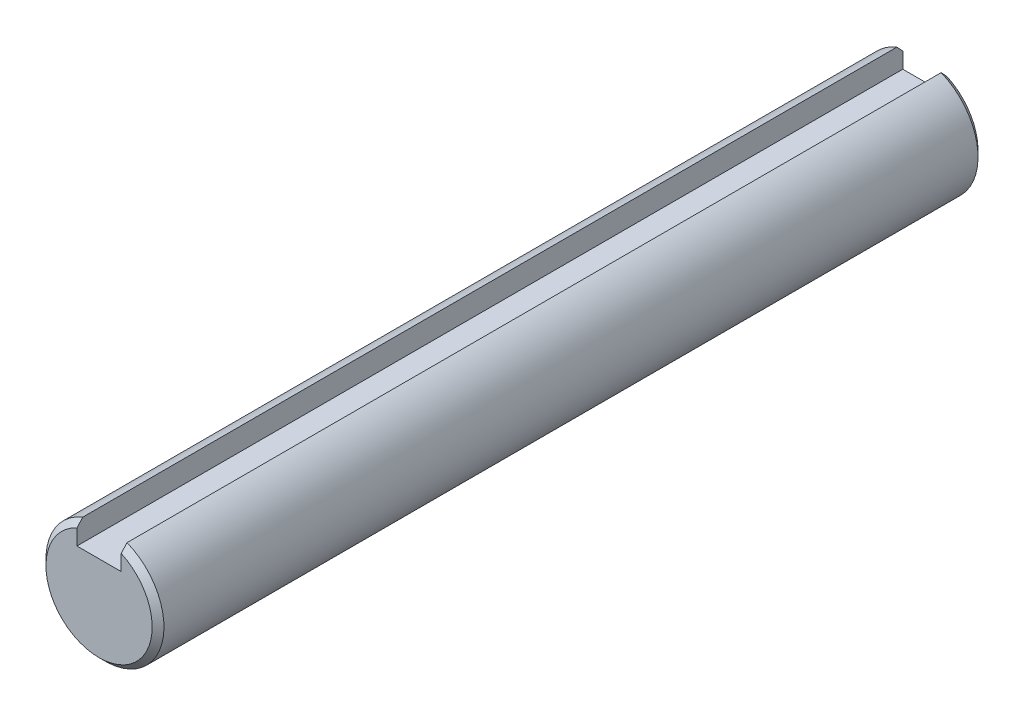
ISO-10303-21;
HEADER;
FILE_DESCRIPTION(('STEP AP214'),'2;1');
FILE_NAME('part.step','',(''),(''),'','','');
FILE_SCHEMA(('AUTOMOTIVE_DESIGN { 1 0 10303 214 1 1 1 1 }'));
ENDSEC;
DATA;
#1=APPLICATION_CONTEXT('core data for automotive mechanical design processes');
#2=APPLICATION_PROTOCOL_DEFINITION('international standard','automotive_design',2000,#1);
#3=PRODUCT_CONTEXT('',#1,'mechanical');
#4=PRODUCT('Part','Part','',(#3));
#5=PRODUCT_RELATED_PRODUCT_CATEGORY('part','',(#4));
#6=PRODUCT_DEFINITION_FORMATION('','',#4);
#7=PRODUCT_DEFINITION_CONTEXT('part definition',#1,'design');
#8=PRODUCT_DEFINITION('design','',#6,#7);
#9=PRODUCT_DEFINITION_SHAPE('','',#8);
#10=(LENGTH_UNIT() NAMED_UNIT(*) SI_UNIT(.MILLI.,.METRE.));
#11=(NAMED_UNIT(*) PLANE_ANGLE_UNIT() SI_UNIT($,.RADIAN.));
#12=(NAMED_UNIT(*) SI_UNIT($,.STERADIAN.) SOLID_ANGLE_UNIT());
#13=UNCERTAINTY_MEASURE_WITH_UNIT(LENGTH_MEASURE(1.E-05),#10,'distance_accuracy_value','');
#14=(GEOMETRIC_REPRESENTATION_CONTEXT(3) GLOBAL_UNCERTAINTY_ASSIGNED_CONTEXT((#13)) GLOBAL_UNIT_ASSIGNED_CONTEXT((#10,
#11,#12)) REPRESENTATION_CONTEXT('',''));
#15=CARTESIAN_POINT('',(0.,0.,0.));
#16=DIRECTION('',(0.,0.,1.));
#17=DIRECTION('',(1.,0.,0.));
#18=AXIS2_PLACEMENT_3D('',#15,#16,#17);
#19=CARTESIAN_POINT('',(0.,0.,-19.05));
#20=DIRECTION('',(0.,0.,1.));
#21=DIRECTION('',(1.,0.,0.));
#22=AXIS2_PLACEMENT_3D('',#19,#20,#21);
#23=CYLINDRICAL_SURFACE('',#22,3.175);
#24=DIRECTION('',(0.,0.,1.));
#25=VECTOR('',#24,1.);
#26=CARTESIAN_POINT('',(-1.190625,2.94330377456609,-19.05));
#27=LINE('',#26,#25);
#28=CARTESIAN_POINT('',(-1.190625,2.94330377456609,-18.7325));
#29=VERTEX_POINT('',#28);
#30=CARTESIAN_POINT('',(-1.190625,2.94330377456609,25.0825));
#31=VERTEX_POINT('',#30);
#32=EDGE_CURVE('E139',#29,#31,#27,.T.);
#33=ORIENTED_EDGE('',*,*,#32,.F.);
#34=CARTESIAN_POINT('',(0.,0.,-18.7325));
#35=DIRECTION('',(0.,0.,1.));
#36=DIRECTION('',(1.,0.,0.));
#37=AXIS2_PLACEMENT_3D('',#34,#35,#36);
#38=CIRCLE('',#37,3.175);
#39=CARTESIAN_POINT('',(1.190625,2.94330377456609,-18.7325));
#40=VERTEX_POINT('',#39);
#41=EDGE_CURVE('E148',#29,#40,#38,.T.);
#42=ORIENTED_EDGE('',*,*,#41,.T.);
#43=DIRECTION('',(0.,0.,1.));
#44=VECTOR('',#43,1.);
#45=CARTESIAN_POINT('',(1.190625,2.94330377456609,-19.05));
#46=LINE('',#45,#44);
#47=CARTESIAN_POINT('',(1.190625,2.94330377456609,25.0825));
#48=VERTEX_POINT('',#47);
#49=EDGE_CURVE('E110',#48,#40,#46,.F.);
#50=ORIENTED_EDGE('',*,*,#49,.F.);
#51=CARTESIAN_POINT('',(0.,0.,25.0825));
#52=DIRECTION('',(0.,0.,1.));
#53=DIRECTION('',(1.,0.,0.));
#54=AXIS2_PLACEMENT_3D('',#51,#52,#53);
#55=CIRCLE('',#54,3.175);
#56=EDGE_CURVE('E109',#48,#31,#55,.F.);
#57=ORIENTED_EDGE('',*,*,#56,.T.);
#58=EDGE_LOOP('',(#33,#42,#50,#57));
#59=FACE_BOUND('',#58,.T.);
#60=ADVANCED_FACE('F45',(#59),#23,.T.);
#61=CARTESIAN_POINT('',(0.,0.,-19.05));
#62=DIRECTION('',(0.,0.,1.));
#63=DIRECTION('',(1.,0.,0.));
#64=AXIS2_PLACEMENT_3D('',#61,#62,#63);
#65=PLANE('',#64);
#66=DIRECTION('',(0.,1.,0.));
#67=VECTOR('',#66,1.);
#68=CARTESIAN_POINT('',(1.190625,3.175,-19.05));
#69=LINE('',#68,#67);
#70=CARTESIAN_POINT('',(1.190625,1.75267877456609,-19.05));
#71=VERTEX_POINT('',#70);
#72=CARTESIAN_POINT('',(1.190625,2.5976370722976,-19.05));
#73=VERTEX_POINT('',#72);
#74=EDGE_CURVE('E121',#71,#73,#69,.T.);
#75=ORIENTED_EDGE('',*,*,#74,.T.);
#76=CARTESIAN_POINT('',(0.,0.,-19.05));
#77=DIRECTION('',(0.,0.,1.));
#78=DIRECTION('',(1.,0.,0.));
#79=AXIS2_PLACEMENT_3D('',#76,#77,#78);
#80=CIRCLE('',#79,2.85749999999998);
#81=CARTESIAN_POINT('',(-1.190625,2.5976370722976,-19.05));
#82=VERTEX_POINT('',#81);
#83=EDGE_CURVE('E70',#73,#82,#80,.F.);
#84=ORIENTED_EDGE('',*,*,#83,.T.);
#85=DIRECTION('',(0.,-1.,0.));
#86=VECTOR('',#85,1.);
#87=CARTESIAN_POINT('',(-1.190625,3.175,-19.05));
#88=LINE('',#87,#86);
#89=CARTESIAN_POINT('',(-1.190625,1.75267877456609,-19.05));
#90=VERTEX_POINT('',#89);
#91=EDGE_CURVE('E129',#82,#90,#88,.T.);
#92=ORIENTED_EDGE('',*,*,#91,.T.);
#93=DIRECTION('',(1.,0.,0.));
#94=VECTOR('',#93,1.);
#95=CARTESIAN_POINT('',(-1.190625,1.75267877456609,-19.05));
#96=LINE('',#95,#94);
#97=EDGE_CURVE('E118',#90,#71,#96,.T.);
#98=ORIENTED_EDGE('',*,*,#97,.T.);
#99=EDGE_LOOP('',(#75,#84,#92,#98));
#100=FACE_BOUND('',#99,.T.);
#101=ADVANCED_FACE('F196',(#100),#65,.F.);
#102=CARTESIAN_POINT('',(0.,0.,25.4));
#103=DIRECTION('',(0.,0.,1.));
#104=DIRECTION('',(1.,0.,0.));
#105=AXIS2_PLACEMENT_3D('',#102,#103,#104);
#106=PLANE('',#105);
#107=DIRECTION('',(0.,-1.,0.));
#108=VECTOR('',#107,1.);
#109=CARTESIAN_POINT('',(-1.190625,0.,25.4));
#110=LINE('',#109,#108);
#111=CARTESIAN_POINT('',(-1.190625,2.59763707229764,25.4));
#112=VERTEX_POINT('',#111);
#113=CARTESIAN_POINT('',(-1.190625,1.75267877456609,25.4));
#114=VERTEX_POINT('',#113);
#115=EDGE_CURVE('E100',#112,#114,#110,.T.);
#116=ORIENTED_EDGE('',*,*,#115,.F.);
#117=CARTESIAN_POINT('',(0.,0.,25.4));
#118=DIRECTION('',(0.,0.,1.));
#119=DIRECTION('',(1.,0.,0.));
#120=AXIS2_PLACEMENT_3D('',#117,#118,#119);
#121=CIRCLE('',#120,2.85750000000001);
#122=CARTESIAN_POINT('',(1.190625,2.59763707229764,25.4));
#123=VERTEX_POINT('',#122);
#124=EDGE_CURVE('E11',#112,#123,#121,.T.);
#125=ORIENTED_EDGE('',*,*,#124,.T.);
#126=DIRECTION('',(0.,1.,0.));
#127=VECTOR('',#126,1.);
#128=CARTESIAN_POINT('',(1.190625,3.175,25.4));
#129=LINE('',#128,#127);
#130=CARTESIAN_POINT('',(1.190625,1.75267877456609,25.4));
#131=VERTEX_POINT('',#130);
#132=EDGE_CURVE('E125',#131,#123,#129,.T.);
#133=ORIENTED_EDGE('',*,*,#132,.F.);
#134=DIRECTION('',(1.,0.,0.));
#135=VECTOR('',#134,1.);
#136=CARTESIAN_POINT('',(-1.190625,1.75267877456609,25.4));
#137=LINE('',#136,#135);
#138=EDGE_CURVE('E115',#114,#131,#137,.T.);
#139=ORIENTED_EDGE('',*,*,#138,.F.);
#140=EDGE_LOOP('',(#116,#125,#133,#139));
#141=FACE_BOUND('',#140,.T.);
#142=ADVANCED_FACE('F123',(#141),#106,.T.);
#143=CARTESIAN_POINT('',(1.190625,3.175,-19.05));
#144=DIRECTION('',(1.,0.,0.));
#145=DIRECTION('',(0.,0.,-1.));
#146=AXIS2_PLACEMENT_3D('',#143,#144,#145);
#147=PLANE('',#146);
#148=ORIENTED_EDGE('',*,*,#49,.T.);
#149=CARTESIAN_POINT('',(1.190625,2.94330377456609,-18.7325));
#150=CARTESIAN_POINT('',(1.190625,2.88594978346214,-18.7856965673544));
#151=CARTESIAN_POINT('',(1.190625,2.82846723837767,-18.8387531761878));
#152=CARTESIAN_POINT('',(1.190625,2.71324500444794,-18.9445865096951));
#153=CARTESIAN_POINT('',(1.190625,2.65550531544291,-18.9973632341951));
#154=CARTESIAN_POINT('',(1.190625,2.5976370722976,-19.05));
#155=B_SPLINE_CURVE_WITH_KNOTS('',3,(#149,#150,#151,#152,#153,#154),.UNSPECIFIED.,.F.,.F.,(4,2,
4),(0.,0.234676842855436,0.46935383154001),.UNSPECIFIED.);
#156=EDGE_CURVE('E160',#40,#73,#155,.T.);
#157=ORIENTED_EDGE('',*,*,#156,.T.);
#158=ORIENTED_EDGE('',*,*,#74,.F.);
#159=DIRECTION('',(0.,0.,1.));
#160=VECTOR('',#159,1.);
#161=CARTESIAN_POINT('',(1.190625,1.75267877456609,-19.05));
#162=LINE('',#161,#160);
#163=EDGE_CURVE('E120',#71,#131,#162,.T.);
#164=ORIENTED_EDGE('',*,*,#163,.T.);
#165=ORIENTED_EDGE('',*,*,#132,.T.);
#166=CARTESIAN_POINT('',(1.190625,2.59763707229764,25.4));
#167=CARTESIAN_POINT('',(1.190625,2.65550531544294,25.3473632341951));
#168=CARTESIAN_POINT('',(1.190625,2.71324500444796,25.2945865096951));
#169=CARTESIAN_POINT('',(1.190625,2.82846723837768,25.1887531761879));
#170=CARTESIAN_POINT('',(1.190625,2.88594978346214,25.1356965673545));
#171=CARTESIAN_POINT('',(1.190625,2.94330377456609,25.0825));
#172=B_SPLINE_CURVE_WITH_KNOTS('',3,(#166,#167,#168,#169,#170,#171),.UNSPECIFIED.,.F.,.F.,(4,2,
4),(0.,0.234676988684552,0.469353831539966),.UNSPECIFIED.);
#173=EDGE_CURVE('E152',#123,#48,#172,.T.);
#174=ORIENTED_EDGE('',*,*,#173,.T.);
#175=EDGE_LOOP('',(#148,#157,#158,#164,#165,#174));
#176=FACE_BOUND('',#175,.T.);
#177=ADVANCED_FACE('F166',(#176),#147,.F.);
#178=CARTESIAN_POINT('',(-1.190625,1.75267877456609,-19.05));
#179=DIRECTION('',(0.,-1.,0.));
#180=DIRECTION('',(0.,0.,-1.));
#181=AXIS2_PLACEMENT_3D('',#178,#179,#180);
#182=PLANE('',#181);
#183=ORIENTED_EDGE('',*,*,#163,.F.);
#184=ORIENTED_EDGE('',*,*,#97,.F.);
#185=DIRECTION('',(0.,0.,1.));
#186=VECTOR('',#185,1.);
#187=CARTESIAN_POINT('',(-1.190625,1.75267877456609,-19.05));
#188=LINE('',#187,#186);
#189=EDGE_CURVE('E103',#90,#114,#188,.T.);
#190=ORIENTED_EDGE('',*,*,#189,.T.);
#191=ORIENTED_EDGE('',*,*,#138,.T.);
#192=EDGE_LOOP('',(#183,#184,#190,#191));
#193=FACE_BOUND('',#192,.T.);
#194=ADVANCED_FACE('F114',(#193),#182,.F.);
#195=CARTESIAN_POINT('',(-1.190625,3.175,-19.05));
#196=DIRECTION('',(-1.,0.,0.));
#197=DIRECTION('',(0.,-1.,0.));
#198=AXIS2_PLACEMENT_3D('',#195,#196,#197);
#199=PLANE('',#198);
#200=ORIENTED_EDGE('',*,*,#91,.F.);
#201=CARTESIAN_POINT('',(-1.190625,2.5976370722976,-19.05));
#202=CARTESIAN_POINT('',(-1.190625,2.65550531544291,-18.9973632341951));
#203=CARTESIAN_POINT('',(-1.190625,2.71324500444794,-18.9445865096951));
#204=CARTESIAN_POINT('',(-1.190625,2.82846723837767,-18.8387531761878));
#205=CARTESIAN_POINT('',(-1.190625,2.88594978346214,-18.7856965673544));
#206=CARTESIAN_POINT('',(-1.190625,2.94330377456609,-18.7325));
#207=B_SPLINE_CURVE_WITH_KNOTS('',3,(#201,#202,#203,#204,#205,#206),.UNSPECIFIED.,.F.,.F.,(4,2,
4),(0.,0.234676988684573,0.469353831540009),.UNSPECIFIED.);
#208=EDGE_CURVE('E55',#82,#29,#207,.T.);
#209=ORIENTED_EDGE('',*,*,#208,.T.);
#210=ORIENTED_EDGE('',*,*,#32,.T.);
#211=CARTESIAN_POINT('',(-1.190625,2.94330377456609,25.0825));
#212=CARTESIAN_POINT('',(-1.190625,2.88594978346214,25.1356965673545));
#213=CARTESIAN_POINT('',(-1.190625,2.82846723837768,25.1887531761879));
#214=CARTESIAN_POINT('',(-1.190625,2.71324500444796,25.2945865096951));
#215=CARTESIAN_POINT('',(-1.190625,2.65550531544294,25.3473632341951));
#216=CARTESIAN_POINT('',(-1.190625,2.59763707229764,25.4));
#217=B_SPLINE_CURVE_WITH_KNOTS('',3,(#211,#212,#213,#214,#215,#216),.UNSPECIFIED.,.F.,.F.,(4,2,
4),(0.,0.234676842855413,0.469353831539964),.UNSPECIFIED.);
#218=EDGE_CURVE('E62',#31,#112,#217,.T.);
#219=ORIENTED_EDGE('',*,*,#218,.T.);
#220=ORIENTED_EDGE('',*,*,#115,.T.);
#221=ORIENTED_EDGE('',*,*,#189,.F.);
#222=EDGE_LOOP('',(#200,#209,#210,#219,#220,#221));
#223=FACE_BOUND('',#222,.T.);
#224=ADVANCED_FACE('F102',(#223),#199,.F.);
#225=CARTESIAN_POINT('',(0.,0.,-18.7325));
#226=DIRECTION('',(0.,0.,1.));
#227=DIRECTION('',(1.,0.,0.));
#228=AXIS2_PLACEMENT_3D('',#225,#226,#227);
#229=CONICAL_SURFACE('',#228,3.175,0.785398163397448);
#230=ORIENTED_EDGE('',*,*,#208,.F.);
#231=ORIENTED_EDGE('',*,*,#83,.F.);
#232=ORIENTED_EDGE('',*,*,#156,.F.);
#233=ORIENTED_EDGE('',*,*,#41,.F.);
#234=EDGE_LOOP('',(#230,#231,#232,#233));
#235=FACE_BOUND('',#234,.T.);
#236=ADVANCED_FACE('F177',(#235),#229,.T.);
#237=CARTESIAN_POINT('',(0.,0.,25.4));
#238=DIRECTION('',(0.,0.,-1.));
#239=DIRECTION('',(-1.,0.,0.));
#240=AXIS2_PLACEMENT_3D('',#237,#238,#239);
#241=CONICAL_SURFACE('',#240,2.85750000000001,0.785398163397442);
#242=ORIENTED_EDGE('',*,*,#218,.F.);
#243=ORIENTED_EDGE('',*,*,#56,.F.);
#244=ORIENTED_EDGE('',*,*,#173,.F.);
#245=ORIENTED_EDGE('',*,*,#124,.F.);
#246=EDGE_LOOP('',(#242,#243,#244,#245));
#247=FACE_BOUND('',#246,.T.);
#248=ADVANCED_FACE('F47',(#247),#241,.T.);
#249=CLOSED_SHELL('',(#60,#101,#142,#177,#194,#224,#236,#248));
#250=MANIFOLD_SOLID_BREP('B2',#249);
#251=ADVANCED_BREP_SHAPE_REPRESENTATION('',(#18,#250),#14);
#252=SHAPE_DEFINITION_REPRESENTATION(#9,#251);
ENDSEC;
END-ISO-10303-21;
